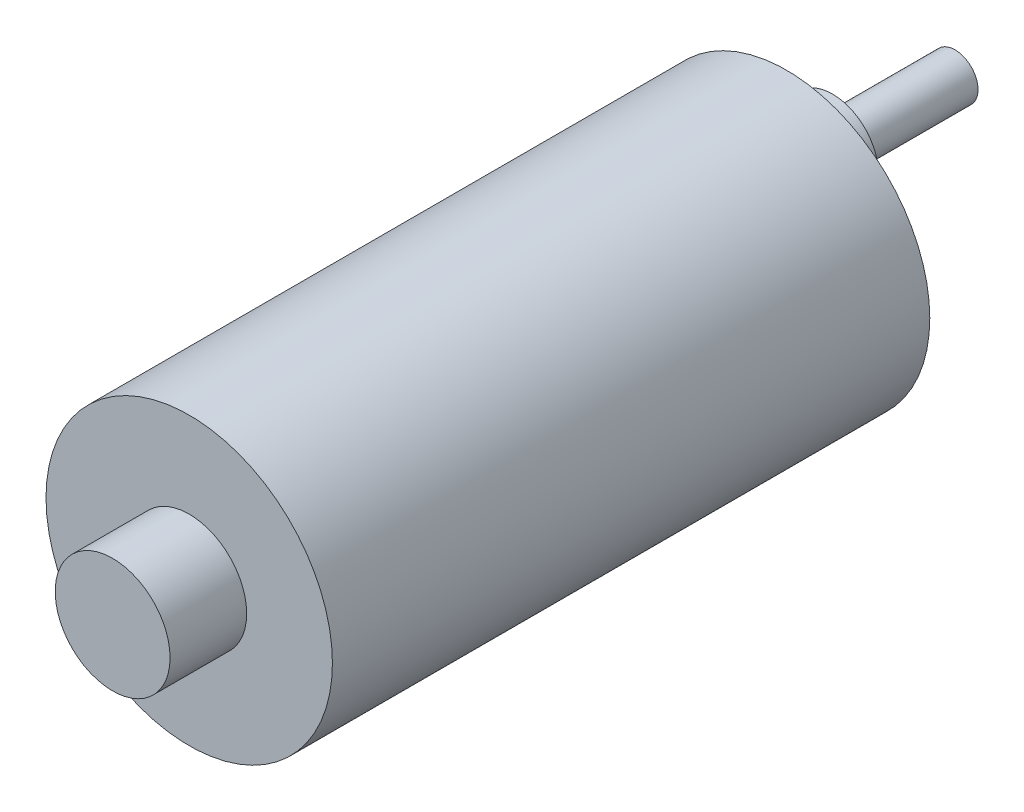
ISO-10303-21;
HEADER;
FILE_DESCRIPTION(('STEP AP214'),'2;1');
FILE_NAME('part.step','',(''),(''),'','','');
FILE_SCHEMA(('AUTOMOTIVE_DESIGN { 1 0 10303 214 1 1 1 1 }'));
ENDSEC;
DATA;
#1=APPLICATION_CONTEXT('core data for automotive mechanical design processes');
#2=APPLICATION_PROTOCOL_DEFINITION('international standard','automotive_design',2000,#1);
#3=PRODUCT_CONTEXT('',#1,'mechanical');
#4=PRODUCT('Part','Part','',(#3));
#5=PRODUCT_RELATED_PRODUCT_CATEGORY('part','',(#4));
#6=PRODUCT_DEFINITION_FORMATION('','',#4);
#7=PRODUCT_DEFINITION_CONTEXT('part definition',#1,'design');
#8=PRODUCT_DEFINITION('design','',#6,#7);
#9=PRODUCT_DEFINITION_SHAPE('','',#8);
#10=(LENGTH_UNIT() NAMED_UNIT(*) SI_UNIT(.MILLI.,.METRE.));
#11=(NAMED_UNIT(*) PLANE_ANGLE_UNIT() SI_UNIT($,.RADIAN.));
#12=(NAMED_UNIT(*) SI_UNIT($,.STERADIAN.) SOLID_ANGLE_UNIT());
#13=UNCERTAINTY_MEASURE_WITH_UNIT(LENGTH_MEASURE(1.E-05),#10,'distance_accuracy_value','');
#14=(GEOMETRIC_REPRESENTATION_CONTEXT(3) GLOBAL_UNCERTAINTY_ASSIGNED_CONTEXT((#13)) GLOBAL_UNIT_ASSIGNED_CONTEXT((#10,
#11,#12)) REPRESENTATION_CONTEXT('',''));
#15=CARTESIAN_POINT('',(0.,0.,0.));
#16=DIRECTION('',(0.,0.,1.));
#17=DIRECTION('',(1.,0.,0.));
#18=AXIS2_PLACEMENT_3D('',#15,#16,#17);
#19=CARTESIAN_POINT('',(0.,0.,78.));
#20=DIRECTION('',(0.,0.,-1.));
#21=DIRECTION('',(-1.,0.,0.));
#22=AXIS2_PLACEMENT_3D('',#19,#20,#21);
#23=CYLINDRICAL_SURFACE('',#22,18.7);
#24=CARTESIAN_POINT('',(0.,0.,78.));
#25=DIRECTION('',(0.,0.,1.));
#26=DIRECTION('',(1.,0.,0.));
#27=AXIS2_PLACEMENT_3D('',#24,#25,#26);
#28=CIRCLE('',#27,18.7);
#29=CARTESIAN_POINT('',(18.7,0.,78.));
#30=VERTEX_POINT('',#29);
#31=EDGE_CURVE('E100',#30,#30,#28,.T.);
#32=ORIENTED_EDGE('',*,*,#31,.F.);
#33=EDGE_LOOP('',(#32));
#34=FACE_BOUND('',#33,.T.);
#35=CARTESIAN_POINT('',(0.,0.,0.));
#36=DIRECTION('',(0.,0.,1.));
#37=DIRECTION('',(1.,0.,0.));
#38=AXIS2_PLACEMENT_3D('',#35,#36,#37);
#39=CIRCLE('',#38,18.7);
#40=CARTESIAN_POINT('',(18.7,0.,0.));
#41=VERTEX_POINT('',#40);
#42=EDGE_CURVE('E95',#41,#41,#39,.T.);
#43=ORIENTED_EDGE('',*,*,#42,.T.);
#44=EDGE_LOOP('',(#43));
#45=FACE_BOUND('',#44,.T.);
#46=ADVANCED_FACE('F45',(#34,#45),#23,.T.);
#47=CARTESIAN_POINT('',(0.,0.,78.));
#48=DIRECTION('',(0.,0.,1.));
#49=DIRECTION('',(1.,0.,0.));
#50=AXIS2_PLACEMENT_3D('',#47,#48,#49);
#51=PLANE('',#50);
#52=CARTESIAN_POINT('',(0.,0.,78.));
#53=DIRECTION('',(0.,0.,1.));
#54=DIRECTION('',(1.,0.,0.));
#55=AXIS2_PLACEMENT_3D('',#52,#53,#54);
#56=CIRCLE('',#55,7.5);
#57=CARTESIAN_POINT('',(7.5,0.,78.));
#58=VERTEX_POINT('',#57);
#59=EDGE_CURVE('E58',#58,#58,#56,.T.);
#60=ORIENTED_EDGE('',*,*,#59,.F.);
#61=EDGE_LOOP('',(#60));
#62=FACE_BOUND('',#61,.T.);
#63=ORIENTED_EDGE('',*,*,#31,.T.);
#64=EDGE_LOOP('',(#63));
#65=FACE_BOUND('',#64,.T.);
#66=ADVANCED_FACE('F135',(#62,#65),#51,.T.);
#67=CARTESIAN_POINT('',(0.,0.,0.));
#68=DIRECTION('',(0.,0.,1.));
#69=DIRECTION('',(1.,0.,0.));
#70=AXIS2_PLACEMENT_3D('',#67,#68,#69);
#71=PLANE('',#70);
#72=CARTESIAN_POINT('',(0.,7.,0.));
#73=DIRECTION('',(0.,0.,1.));
#74=DIRECTION('',(1.,0.,0.));
#75=AXIS2_PLACEMENT_3D('',#72,#73,#74);
#76=CIRCLE('',#75,6.);
#77=CARTESIAN_POINT('',(6.,7.,0.));
#78=VERTEX_POINT('',#77);
#79=EDGE_CURVE('E48',#78,#78,#76,.F.);
#80=ORIENTED_EDGE('',*,*,#79,.F.);
#81=EDGE_LOOP('',(#80));
#82=FACE_BOUND('',#81,.T.);
#83=CARTESIAN_POINT('',(0.,15.5,0.));
#84=DIRECTION('',(0.,0.,1.));
#85=DIRECTION('',(1.,0.,0.));
#86=AXIS2_PLACEMENT_3D('',#83,#84,#85);
#87=CIRCLE('',#86,1.55);
#88=CARTESIAN_POINT('',(1.55,15.5,0.));
#89=VERTEX_POINT('',#88);
#90=EDGE_CURVE('E96',#89,#89,#87,.F.);
#91=ORIENTED_EDGE('',*,*,#90,.F.);
#92=EDGE_LOOP('',(#91));
#93=FACE_BOUND('',#92,.T.);
#94=CARTESIAN_POINT('',(13.4233937586587,7.75000000000016,0.));
#95=DIRECTION('',(0.,0.,1.));
#96=DIRECTION('',(1.,0.,0.));
#97=AXIS2_PLACEMENT_3D('',#94,#95,#96);
#98=CIRCLE('',#97,1.55);
#99=CARTESIAN_POINT('',(14.9733937586587,7.75000000000016,0.));
#100=VERTEX_POINT('',#99);
#101=EDGE_CURVE('E122',#100,#100,#98,.F.);
#102=ORIENTED_EDGE('',*,*,#101,.F.);
#103=EDGE_LOOP('',(#102));
#104=FACE_BOUND('',#103,.T.);
#105=CARTESIAN_POINT('',(13.4233937586589,-7.74999999999987,0.));
#106=DIRECTION('',(0.,0.,1.));
#107=DIRECTION('',(1.,0.,0.));
#108=AXIS2_PLACEMENT_3D('',#105,#106,#107);
#109=CIRCLE('',#108,1.55);
#110=CARTESIAN_POINT('',(14.9733937586589,-7.74999999999987,0.));
#111=VERTEX_POINT('',#110);
#112=EDGE_CURVE('E118',#111,#111,#109,.F.);
#113=ORIENTED_EDGE('',*,*,#112,.F.);
#114=EDGE_LOOP('',(#113));
#115=FACE_BOUND('',#114,.T.);
#116=CARTESIAN_POINT('',(1.08235921504137E-13,-15.5,0.));
#117=DIRECTION('',(0.,0.,1.));
#118=DIRECTION('',(1.,0.,0.));
#119=AXIS2_PLACEMENT_3D('',#116,#117,#118);
#120=CIRCLE('',#119,1.55);
#121=CARTESIAN_POINT('',(1.55000000000011,-15.5,0.));
#122=VERTEX_POINT('',#121);
#123=EDGE_CURVE('E114',#122,#122,#120,.F.);
#124=ORIENTED_EDGE('',*,*,#123,.F.);
#125=EDGE_LOOP('',(#124));
#126=FACE_BOUND('',#125,.T.);
#127=CARTESIAN_POINT('',(-13.4233937586588,-7.75000000000006,0.));
#128=DIRECTION('',(0.,0.,1.));
#129=DIRECTION('',(1.,0.,0.));
#130=AXIS2_PLACEMENT_3D('',#127,#128,#129);
#131=CIRCLE('',#130,1.55);
#132=CARTESIAN_POINT('',(-11.8733937586588,-7.75000000000006,0.));
#133=VERTEX_POINT('',#132);
#134=EDGE_CURVE('E110',#133,#133,#131,.F.);
#135=ORIENTED_EDGE('',*,*,#134,.F.);
#136=EDGE_LOOP('',(#135));
#137=FACE_BOUND('',#136,.T.);
#138=CARTESIAN_POINT('',(-13.4233937586588,7.74999999999997,0.));
#139=DIRECTION('',(0.,0.,1.));
#140=DIRECTION('',(1.,0.,0.));
#141=AXIS2_PLACEMENT_3D('',#138,#139,#140);
#142=CIRCLE('',#141,1.55);
#143=CARTESIAN_POINT('',(-11.8733937586588,7.74999999999997,0.));
#144=VERTEX_POINT('',#143);
#145=EDGE_CURVE('E90',#144,#144,#142,.F.);
#146=ORIENTED_EDGE('',*,*,#145,.F.);
#147=EDGE_LOOP('',(#146));
#148=FACE_BOUND('',#147,.T.);
#149=ORIENTED_EDGE('',*,*,#42,.F.);
#150=EDGE_LOOP('',(#149));
#151=FACE_BOUND('',#150,.T.);
#152=ADVANCED_FACE('F131',(#82,#93,#104,#115,#126,#137,#148,#151),#71,.F.);
#153=CARTESIAN_POINT('',(0.,0.,88.));
#154=DIRECTION('',(0.,0.,-1.));
#155=DIRECTION('',(-1.,0.,0.));
#156=AXIS2_PLACEMENT_3D('',#153,#154,#155);
#157=CYLINDRICAL_SURFACE('',#156,7.5);
#158=CARTESIAN_POINT('',(0.,0.,88.));
#159=DIRECTION('',(0.,0.,1.));
#160=DIRECTION('',(1.,0.,0.));
#161=AXIS2_PLACEMENT_3D('',#158,#159,#160);
#162=CIRCLE('',#161,7.5);
#163=CARTESIAN_POINT('',(7.5,0.,88.));
#164=VERTEX_POINT('',#163);
#165=EDGE_CURVE('E91',#164,#164,#162,.T.);
#166=ORIENTED_EDGE('',*,*,#165,.F.);
#167=EDGE_LOOP('',(#166));
#168=FACE_BOUND('',#167,.T.);
#169=ORIENTED_EDGE('',*,*,#59,.T.);
#170=EDGE_LOOP('',(#169));
#171=FACE_BOUND('',#170,.T.);
#172=ADVANCED_FACE('F134',(#168,#171),#157,.T.);
#173=CARTESIAN_POINT('',(0.,0.,88.));
#174=DIRECTION('',(0.,0.,1.));
#175=DIRECTION('',(1.,0.,0.));
#176=AXIS2_PLACEMENT_3D('',#173,#174,#175);
#177=PLANE('',#176);
#178=ORIENTED_EDGE('',*,*,#165,.T.);
#179=EDGE_LOOP('',(#178));
#180=FACE_BOUND('',#179,.T.);
#181=ADVANCED_FACE('F164',(#180),#177,.T.);
#182=CARTESIAN_POINT('',(-13.4233937586588,7.74999999999997,-1.2E-05));
#183=DIRECTION('',(0.,0.,1.));
#184=DIRECTION('',(1.,0.,0.));
#185=AXIS2_PLACEMENT_3D('',#182,#183,#184);
#186=CYLINDRICAL_SURFACE('',#185,1.55);
#187=CARTESIAN_POINT('',(-13.4233937586588,7.74999999999997,10.));
#188=DIRECTION('',(0.,0.,-1.));
#189=DIRECTION('',(-1.,0.,0.));
#190=AXIS2_PLACEMENT_3D('',#187,#188,#189);
#191=CIRCLE('',#190,1.55);
#192=CARTESIAN_POINT('',(-11.8733937586588,7.74999999999997,10.));
#193=VERTEX_POINT('',#192);
#194=EDGE_CURVE('E71',#193,#193,#191,.T.);
#195=CARTESIAN_POINT('',(-11.8733937586588,7.74999999999997,10.));
#196=CARTESIAN_POINT('',(-11.8733937586588,7.74999999999997,9.89583333333333));
#197=CARTESIAN_POINT('',(-11.8733937586588,7.74999999999997,9.79166666666667));
#198=CARTESIAN_POINT('',(-11.8733937586588,7.74999999999997,9.58333333333333));
#199=CARTESIAN_POINT('',(-11.8733937586588,7.74999999999997,9.47916666666667));
#200=CARTESIAN_POINT('',(-11.8733937586588,7.74999999999997,9.27083333333333));
#201=CARTESIAN_POINT('',(-11.8733937586588,7.74999999999997,9.16666666666667));
#202=CARTESIAN_POINT('',(-11.8733937586588,7.74999999999997,8.95833333333333));
#203=CARTESIAN_POINT('',(-11.8733937586588,7.74999999999997,8.85416666666667));
#204=CARTESIAN_POINT('',(-11.8733937586588,7.74999999999997,8.64583333333333));
#205=CARTESIAN_POINT('',(-11.8733937586588,7.74999999999997,8.54166666666667));
#206=CARTESIAN_POINT('',(-11.8733937586588,7.74999999999997,8.33333333333333));
#207=CARTESIAN_POINT('',(-11.8733937586588,7.74999999999997,8.22916666666667));
#208=CARTESIAN_POINT('',(-11.8733937586588,7.74999999999997,8.02083333333333));
#209=CARTESIAN_POINT('',(-11.8733937586588,7.74999999999997,7.91666666666667));
#210=CARTESIAN_POINT('',(-11.8733937586588,7.74999999999997,7.70833333333333));
#211=CARTESIAN_POINT('',(-11.8733937586588,7.74999999999997,7.60416666666667));
#212=CARTESIAN_POINT('',(-11.8733937586588,7.74999999999997,7.39583333333333));
#213=CARTESIAN_POINT('',(-11.8733937586588,7.74999999999997,7.29166666666667));
#214=CARTESIAN_POINT('',(-11.8733937586588,7.74999999999997,7.08333333333333));
#215=CARTESIAN_POINT('',(-11.8733937586588,7.74999999999997,6.97916666666667));
#216=CARTESIAN_POINT('',(-11.8733937586588,7.74999999999997,6.77083333333333));
#217=CARTESIAN_POINT('',(-11.8733937586588,7.74999999999997,6.66666666666667));
#218=CARTESIAN_POINT('',(-11.8733937586588,7.74999999999997,6.45833333333333));
#219=CARTESIAN_POINT('',(-11.8733937586588,7.74999999999997,6.35416666666667));
#220=CARTESIAN_POINT('',(-11.8733937586588,7.74999999999997,6.14583333333333));
#221=CARTESIAN_POINT('',(-11.8733937586588,7.74999999999997,6.04166666666667));
#222=CARTESIAN_POINT('',(-11.8733937586588,7.74999999999997,5.83333333333333));
#223=CARTESIAN_POINT('',(-11.8733937586588,7.74999999999997,5.72916666666667));
#224=CARTESIAN_POINT('',(-11.8733937586588,7.74999999999997,5.52083333333333));
#225=CARTESIAN_POINT('',(-11.8733937586588,7.74999999999997,5.41666666666667));
#226=CARTESIAN_POINT('',(-11.8733937586588,7.74999999999997,5.20833333333333));
#227=CARTESIAN_POINT('',(-11.8733937586588,7.74999999999997,5.10416666666667));
#228=CARTESIAN_POINT('',(-11.8733937586588,7.74999999999997,4.89583333333333));
#229=CARTESIAN_POINT('',(-11.8733937586588,7.74999999999997,4.79166666666667));
#230=CARTESIAN_POINT('',(-11.8733937586588,7.74999999999997,4.58333333333333));
#231=CARTESIAN_POINT('',(-11.8733937586588,7.74999999999997,4.47916666666667));
#232=CARTESIAN_POINT('',(-11.8733937586588,7.74999999999997,4.27083333333333));
#233=CARTESIAN_POINT('',(-11.8733937586588,7.74999999999997,4.16666666666667));
#234=CARTESIAN_POINT('',(-11.8733937586588,7.74999999999997,3.95833333333333));
#235=CARTESIAN_POINT('',(-11.8733937586588,7.74999999999997,3.85416666666667));
#236=CARTESIAN_POINT('',(-11.8733937586588,7.74999999999997,3.64583333333333));
#237=CARTESIAN_POINT('',(-11.8733937586588,7.74999999999997,3.54166666666667));
#238=CARTESIAN_POINT('',(-11.8733937586588,7.74999999999997,3.33333333333333));
#239=CARTESIAN_POINT('',(-11.8733937586588,7.74999999999997,3.22916666666667));
#240=CARTESIAN_POINT('',(-11.8733937586588,7.74999999999997,3.02083333333333));
#241=CARTESIAN_POINT('',(-11.8733937586588,7.74999999999997,2.91666666666667));
#242=CARTESIAN_POINT('',(-11.8733937586588,7.74999999999997,2.70833333333333));
#243=CARTESIAN_POINT('',(-11.8733937586588,7.74999999999997,2.60416666666667));
#244=CARTESIAN_POINT('',(-11.8733937586588,7.74999999999997,2.39583333333333));
#245=CARTESIAN_POINT('',(-11.8733937586588,7.74999999999997,2.29166666666667));
#246=CARTESIAN_POINT('',(-11.8733937586588,7.74999999999997,2.08333333333333));
#247=CARTESIAN_POINT('',(-11.8733937586588,7.74999999999997,1.97916666666667));
#248=CARTESIAN_POINT('',(-11.8733937586588,7.74999999999997,1.77083333333333));
#249=CARTESIAN_POINT('',(-11.8733937586588,7.74999999999997,1.66666666666667));
#250=CARTESIAN_POINT('',(-11.8733937586588,7.74999999999997,1.45833333333333));
#251=CARTESIAN_POINT('',(-11.8733937586588,7.74999999999997,1.35416666666667));
#252=CARTESIAN_POINT('',(-11.8733937586588,7.74999999999997,1.14583333333333));
#253=CARTESIAN_POINT('',(-11.8733937586588,7.74999999999997,1.04166666666667));
#254=CARTESIAN_POINT('',(-11.8733937586588,7.74999999999997,0.833333333333335));
#255=CARTESIAN_POINT('',(-11.8733937586588,7.74999999999997,0.729166666666668));
#256=CARTESIAN_POINT('',(-11.8733937586588,7.74999999999997,0.520833333333334));
#257=CARTESIAN_POINT('',(-11.8733937586588,7.74999999999997,0.416666666666668));
#258=CARTESIAN_POINT('',(-11.8733937586588,7.74999999999997,0.208333333333334));
#259=CARTESIAN_POINT('',(-11.8733937586588,7.74999999999997,0.104166666666667));
#260=CARTESIAN_POINT('',(-11.8733937586588,7.74999999999997,0.));
#261=B_SPLINE_CURVE_WITH_KNOTS('',3,(#195,#196,#197,#198,#199,#200,#201,#202,#203,#204,#205,
#206,#207,#208,#209,#210,#211,#212,#213,#214,#215,#216,#217,#218,#219,#220,#221,#222,#223,#224,
#225,#226,#227,#228,#229,#230,#231,#232,#233,#234,#235,#236,#237,#238,#239,#240,#241,#242,#243,
#244,#245,#246,#247,#248,#249,#250,#251,#252,#253,#254,#255,#256,#257,#258,#259,#260),
.UNSPECIFIED.,.F.,.F.,(4,2,2,2,2,2,2,2,2,2,2,2,2,2,2,2,2,2,2,2,2,2,2,2,2,2,2,2,2,2,2,2,4),(0.,
0.3125,0.625000000000001,0.937500000000001,1.25,1.5625,1.875,2.1875,2.5,2.8125,3.125,3.4375,
3.75,4.0625,4.375,4.6875,5.,5.3125,5.625,5.9375,6.25,6.5625,6.875,7.1875,7.5,7.8125,8.125,
8.4375,8.75,9.0625,9.375,9.6875,10.),.UNSPECIFIED.);
#262=EDGE_CURVE('BSEAM168',#193,#144,#261,.T.);
#263=ORIENTED_EDGE('',*,*,#194,.F.);
#264=ORIENTED_EDGE('',*,*,#145,.T.);
#265=ORIENTED_EDGE('',*,*,#262,.T.);
#266=ORIENTED_EDGE('',*,*,#262,.F.);
#267=EDGE_LOOP('',(#263,#265,#264,#266));
#268=FACE_BOUND('',#267,.T.);
#269=ADVANCED_FACE('F168',(#268),#186,.F.);
#270=CARTESIAN_POINT('',(-13.4233937586588,7.74999999999997,10.));
#271=DIRECTION('',(0.,0.,-1.));
#272=DIRECTION('',(-1.,0.,0.));
#273=AXIS2_PLACEMENT_3D('',#270,#271,#272);
#274=PLANE('',#273);
#275=ORIENTED_EDGE('',*,*,#194,.T.);
#276=EDGE_LOOP('',(#275));
#277=FACE_BOUND('',#276,.T.);
#278=ADVANCED_FACE('F172',(#277),#274,.T.);
#279=CARTESIAN_POINT('',(-13.4233937586588,-7.75000000000006,-1.2E-05));
#280=DIRECTION('',(0.,0.,1.));
#281=DIRECTION('',(1.,0.,0.));
#282=AXIS2_PLACEMENT_3D('',#279,#280,#281);
#283=CYLINDRICAL_SURFACE('',#282,1.55);
#284=CARTESIAN_POINT('',(-13.4233937586588,-7.75000000000006,10.));
#285=DIRECTION('',(0.,0.,-1.));
#286=DIRECTION('',(-1.,0.,0.));
#287=AXIS2_PLACEMENT_3D('',#284,#285,#286);
#288=CIRCLE('',#287,1.55);
#289=CARTESIAN_POINT('',(-11.8733937586588,-7.75000000000006,10.));
#290=VERTEX_POINT('',#289);
#291=EDGE_CURVE('E67',#290,#290,#288,.T.);
#292=CARTESIAN_POINT('',(-11.8733937586588,-7.75000000000006,10.));
#293=CARTESIAN_POINT('',(-11.8733937586588,-7.75000000000006,9.89583333333333));
#294=CARTESIAN_POINT('',(-11.8733937586588,-7.75000000000006,9.79166666666667));
#295=CARTESIAN_POINT('',(-11.8733937586588,-7.75000000000006,9.58333333333333));
#296=CARTESIAN_POINT('',(-11.8733937586588,-7.75000000000006,9.47916666666667));
#297=CARTESIAN_POINT('',(-11.8733937586588,-7.75000000000006,9.27083333333333));
#298=CARTESIAN_POINT('',(-11.8733937586588,-7.75000000000006,9.16666666666667));
#299=CARTESIAN_POINT('',(-11.8733937586588,-7.75000000000006,8.95833333333333));
#300=CARTESIAN_POINT('',(-11.8733937586588,-7.75000000000006,8.85416666666667));
#301=CARTESIAN_POINT('',(-11.8733937586588,-7.75000000000006,8.64583333333333));
#302=CARTESIAN_POINT('',(-11.8733937586588,-7.75000000000006,8.54166666666667));
#303=CARTESIAN_POINT('',(-11.8733937586588,-7.75000000000006,8.33333333333333));
#304=CARTESIAN_POINT('',(-11.8733937586588,-7.75000000000006,8.22916666666667));
#305=CARTESIAN_POINT('',(-11.8733937586588,-7.75000000000006,8.02083333333333));
#306=CARTESIAN_POINT('',(-11.8733937586588,-7.75000000000006,7.91666666666667));
#307=CARTESIAN_POINT('',(-11.8733937586588,-7.75000000000006,7.70833333333333));
#308=CARTESIAN_POINT('',(-11.8733937586588,-7.75000000000006,7.60416666666667));
#309=CARTESIAN_POINT('',(-11.8733937586588,-7.75000000000006,7.39583333333333));
#310=CARTESIAN_POINT('',(-11.8733937586588,-7.75000000000006,7.29166666666667));
#311=CARTESIAN_POINT('',(-11.8733937586588,-7.75000000000006,7.08333333333333));
#312=CARTESIAN_POINT('',(-11.8733937586588,-7.75000000000006,6.97916666666667));
#313=CARTESIAN_POINT('',(-11.8733937586588,-7.75000000000006,6.77083333333333));
#314=CARTESIAN_POINT('',(-11.8733937586588,-7.75000000000006,6.66666666666667));
#315=CARTESIAN_POINT('',(-11.8733937586588,-7.75000000000006,6.45833333333333));
#316=CARTESIAN_POINT('',(-11.8733937586588,-7.75000000000006,6.35416666666667));
#317=CARTESIAN_POINT('',(-11.8733937586588,-7.75000000000006,6.14583333333333));
#318=CARTESIAN_POINT('',(-11.8733937586588,-7.75000000000006,6.04166666666667));
#319=CARTESIAN_POINT('',(-11.8733937586588,-7.75000000000006,5.83333333333333));
#320=CARTESIAN_POINT('',(-11.8733937586588,-7.75000000000006,5.72916666666667));
#321=CARTESIAN_POINT('',(-11.8733937586588,-7.75000000000006,5.52083333333333));
#322=CARTESIAN_POINT('',(-11.8733937586588,-7.75000000000006,5.41666666666667));
#323=CARTESIAN_POINT('',(-11.8733937586588,-7.75000000000006,5.20833333333333));
#324=CARTESIAN_POINT('',(-11.8733937586588,-7.75000000000006,5.10416666666667));
#325=CARTESIAN_POINT('',(-11.8733937586588,-7.75000000000006,4.89583333333333));
#326=CARTESIAN_POINT('',(-11.8733937586588,-7.75000000000006,4.79166666666667));
#327=CARTESIAN_POINT('',(-11.8733937586588,-7.75000000000006,4.58333333333333));
#328=CARTESIAN_POINT('',(-11.8733937586588,-7.75000000000006,4.47916666666667));
#329=CARTESIAN_POINT('',(-11.8733937586588,-7.75000000000006,4.27083333333333));
#330=CARTESIAN_POINT('',(-11.8733937586588,-7.75000000000006,4.16666666666667));
#331=CARTESIAN_POINT('',(-11.8733937586588,-7.75000000000006,3.95833333333333));
#332=CARTESIAN_POINT('',(-11.8733937586588,-7.75000000000006,3.85416666666667));
#333=CARTESIAN_POINT('',(-11.8733937586588,-7.75000000000006,3.64583333333333));
#334=CARTESIAN_POINT('',(-11.8733937586588,-7.75000000000006,3.54166666666667));
#335=CARTESIAN_POINT('',(-11.8733937586588,-7.75000000000006,3.33333333333333));
#336=CARTESIAN_POINT('',(-11.8733937586588,-7.75000000000006,3.22916666666667));
#337=CARTESIAN_POINT('',(-11.8733937586588,-7.75000000000006,3.02083333333333));
#338=CARTESIAN_POINT('',(-11.8733937586588,-7.75000000000006,2.91666666666667));
#339=CARTESIAN_POINT('',(-11.8733937586588,-7.75000000000006,2.70833333333333));
#340=CARTESIAN_POINT('',(-11.8733937586588,-7.75000000000006,2.60416666666667));
#341=CARTESIAN_POINT('',(-11.8733937586588,-7.75000000000006,2.39583333333333));
#342=CARTESIAN_POINT('',(-11.8733937586588,-7.75000000000006,2.29166666666667));
#343=CARTESIAN_POINT('',(-11.8733937586588,-7.75000000000006,2.08333333333333));
#344=CARTESIAN_POINT('',(-11.8733937586588,-7.75000000000006,1.97916666666667));
#345=CARTESIAN_POINT('',(-11.8733937586588,-7.75000000000006,1.77083333333333));
#346=CARTESIAN_POINT('',(-11.8733937586588,-7.75000000000006,1.66666666666667));
#347=CARTESIAN_POINT('',(-11.8733937586588,-7.75000000000006,1.45833333333333));
#348=CARTESIAN_POINT('',(-11.8733937586588,-7.75000000000006,1.35416666666667));
#349=CARTESIAN_POINT('',(-11.8733937586588,-7.75000000000006,1.14583333333333));
#350=CARTESIAN_POINT('',(-11.8733937586588,-7.75000000000006,1.04166666666667));
#351=CARTESIAN_POINT('',(-11.8733937586588,-7.75000000000006,0.833333333333335));
#352=CARTESIAN_POINT('',(-11.8733937586588,-7.75000000000006,0.729166666666668));
#353=CARTESIAN_POINT('',(-11.8733937586588,-7.75000000000006,0.520833333333334));
#354=CARTESIAN_POINT('',(-11.8733937586588,-7.75000000000006,0.416666666666668));
#355=CARTESIAN_POINT('',(-11.8733937586588,-7.75000000000006,0.208333333333334));
#356=CARTESIAN_POINT('',(-11.8733937586588,-7.75000000000006,0.104166666666667));
#357=CARTESIAN_POINT('',(-11.8733937586588,-7.75000000000006,0.));
#358=B_SPLINE_CURVE_WITH_KNOTS('',3,(#292,#293,#294,#295,#296,#297,#298,#299,#300,#301,#302,
#303,#304,#305,#306,#307,#308,#309,#310,#311,#312,#313,#314,#315,#316,#317,#318,#319,#320,#321,
#322,#323,#324,#325,#326,#327,#328,#329,#330,#331,#332,#333,#334,#335,#336,#337,#338,#339,#340,
#341,#342,#343,#344,#345,#346,#347,#348,#349,#350,#351,#352,#353,#354,#355,#356,#357),
.UNSPECIFIED.,.F.,.F.,(4,2,2,2,2,2,2,2,2,2,2,2,2,2,2,2,2,2,2,2,2,2,2,2,2,2,2,2,2,2,2,2,4),(0.,
0.3125,0.625000000000001,0.937500000000001,1.25,1.5625,1.875,2.1875,2.5,2.8125,3.125,3.4375,
3.75,4.0625,4.375,4.6875,5.,5.3125,5.625,5.9375,6.25,6.5625,6.875,7.1875,7.5,7.8125,8.125,
8.4375,8.75,9.0625,9.375,9.6875,10.),.UNSPECIFIED.);
#359=EDGE_CURVE('BSEAM176',#290,#133,#358,.T.);
#360=ORIENTED_EDGE('',*,*,#291,.F.);
#361=ORIENTED_EDGE('',*,*,#134,.T.);
#362=ORIENTED_EDGE('',*,*,#359,.T.);
#363=ORIENTED_EDGE('',*,*,#359,.F.);
#364=EDGE_LOOP('',(#360,#362,#361,#363));
#365=FACE_BOUND('',#364,.T.);
#366=ADVANCED_FACE('F176',(#365),#283,.F.);
#367=CARTESIAN_POINT('',(-13.4233937586588,-7.75000000000006,10.));
#368=DIRECTION('',(0.,0.,-1.));
#369=DIRECTION('',(-1.,0.,0.));
#370=AXIS2_PLACEMENT_3D('',#367,#368,#369);
#371=PLANE('',#370);
#372=ORIENTED_EDGE('',*,*,#291,.T.);
#373=EDGE_LOOP('',(#372));
#374=FACE_BOUND('',#373,.T.);
#375=ADVANCED_FACE('F209',(#374),#371,.T.);
#376=CARTESIAN_POINT('',(1.08235921504137E-13,-15.5,-1.2E-05));
#377=DIRECTION('',(0.,0.,1.));
#378=DIRECTION('',(1.,0.,0.));
#379=AXIS2_PLACEMENT_3D('',#376,#377,#378);
#380=CYLINDRICAL_SURFACE('',#379,1.55);
#381=CARTESIAN_POINT('',(1.08235921504137E-13,-15.5,10.));
#382=DIRECTION('',(0.,0.,-1.));
#383=DIRECTION('',(-1.,0.,0.));
#384=AXIS2_PLACEMENT_3D('',#381,#382,#383);
#385=CIRCLE('',#384,1.55);
#386=CARTESIAN_POINT('',(1.55000000000011,-15.5,10.));
#387=VERTEX_POINT('',#386);
#388=EDGE_CURVE('E72',#387,#387,#385,.T.);
#389=CARTESIAN_POINT('',(1.55000000000011,-15.5,10.));
#390=CARTESIAN_POINT('',(1.55000000000011,-15.5,9.89583333333333));
#391=CARTESIAN_POINT('',(1.55000000000011,-15.5,9.79166666666667));
#392=CARTESIAN_POINT('',(1.55000000000011,-15.5,9.58333333333333));
#393=CARTESIAN_POINT('',(1.55000000000011,-15.5,9.47916666666667));
#394=CARTESIAN_POINT('',(1.55000000000011,-15.5,9.27083333333333));
#395=CARTESIAN_POINT('',(1.55000000000011,-15.5,9.16666666666667));
#396=CARTESIAN_POINT('',(1.55000000000011,-15.5,8.95833333333333));
#397=CARTESIAN_POINT('',(1.55000000000011,-15.5,8.85416666666667));
#398=CARTESIAN_POINT('',(1.55000000000011,-15.5,8.64583333333333));
#399=CARTESIAN_POINT('',(1.55000000000011,-15.5,8.54166666666667));
#400=CARTESIAN_POINT('',(1.55000000000011,-15.5,8.33333333333333));
#401=CARTESIAN_POINT('',(1.55000000000011,-15.5,8.22916666666667));
#402=CARTESIAN_POINT('',(1.55000000000011,-15.5,8.02083333333333));
#403=CARTESIAN_POINT('',(1.55000000000011,-15.5,7.91666666666667));
#404=CARTESIAN_POINT('',(1.55000000000011,-15.5,7.70833333333333));
#405=CARTESIAN_POINT('',(1.55000000000011,-15.5,7.60416666666667));
#406=CARTESIAN_POINT('',(1.55000000000011,-15.5,7.39583333333333));
#407=CARTESIAN_POINT('',(1.55000000000011,-15.5,7.29166666666667));
#408=CARTESIAN_POINT('',(1.55000000000011,-15.5,7.08333333333333));
#409=CARTESIAN_POINT('',(1.55000000000011,-15.5,6.97916666666667));
#410=CARTESIAN_POINT('',(1.55000000000011,-15.5,6.77083333333333));
#411=CARTESIAN_POINT('',(1.55000000000011,-15.5,6.66666666666667));
#412=CARTESIAN_POINT('',(1.55000000000011,-15.5,6.45833333333333));
#413=CARTESIAN_POINT('',(1.55000000000011,-15.5,6.35416666666667));
#414=CARTESIAN_POINT('',(1.55000000000011,-15.5,6.14583333333333));
#415=CARTESIAN_POINT('',(1.55000000000011,-15.5,6.04166666666667));
#416=CARTESIAN_POINT('',(1.55000000000011,-15.5,5.83333333333333));
#417=CARTESIAN_POINT('',(1.55000000000011,-15.5,5.72916666666667));
#418=CARTESIAN_POINT('',(1.55000000000011,-15.5,5.52083333333333));
#419=CARTESIAN_POINT('',(1.55000000000011,-15.5,5.41666666666667));
#420=CARTESIAN_POINT('',(1.55000000000011,-15.5,5.20833333333333));
#421=CARTESIAN_POINT('',(1.55000000000011,-15.5,5.10416666666667));
#422=CARTESIAN_POINT('',(1.55000000000011,-15.5,4.89583333333333));
#423=CARTESIAN_POINT('',(1.55000000000011,-15.5,4.79166666666667));
#424=CARTESIAN_POINT('',(1.55000000000011,-15.5,4.58333333333333));
#425=CARTESIAN_POINT('',(1.55000000000011,-15.5,4.47916666666667));
#426=CARTESIAN_POINT('',(1.55000000000011,-15.5,4.27083333333333));
#427=CARTESIAN_POINT('',(1.55000000000011,-15.5,4.16666666666667));
#428=CARTESIAN_POINT('',(1.55000000000011,-15.5,3.95833333333333));
#429=CARTESIAN_POINT('',(1.55000000000011,-15.5,3.85416666666667));
#430=CARTESIAN_POINT('',(1.55000000000011,-15.5,3.64583333333333));
#431=CARTESIAN_POINT('',(1.55000000000011,-15.5,3.54166666666667));
#432=CARTESIAN_POINT('',(1.55000000000011,-15.5,3.33333333333333));
#433=CARTESIAN_POINT('',(1.55000000000011,-15.5,3.22916666666667));
#434=CARTESIAN_POINT('',(1.55000000000011,-15.5,3.02083333333333));
#435=CARTESIAN_POINT('',(1.55000000000011,-15.5,2.91666666666667));
#436=CARTESIAN_POINT('',(1.55000000000011,-15.5,2.70833333333333));
#437=CARTESIAN_POINT('',(1.55000000000011,-15.5,2.60416666666667));
#438=CARTESIAN_POINT('',(1.55000000000011,-15.5,2.39583333333333));
#439=CARTESIAN_POINT('',(1.55000000000011,-15.5,2.29166666666667));
#440=CARTESIAN_POINT('',(1.55000000000011,-15.5,2.08333333333333));
#441=CARTESIAN_POINT('',(1.55000000000011,-15.5,1.97916666666667));
#442=CARTESIAN_POINT('',(1.55000000000011,-15.5,1.77083333333333));
#443=CARTESIAN_POINT('',(1.55000000000011,-15.5,1.66666666666667));
#444=CARTESIAN_POINT('',(1.55000000000011,-15.5,1.45833333333333));
#445=CARTESIAN_POINT('',(1.55000000000011,-15.5,1.35416666666667));
#446=CARTESIAN_POINT('',(1.55000000000011,-15.5,1.14583333333333));
#447=CARTESIAN_POINT('',(1.55000000000011,-15.5,1.04166666666667));
#448=CARTESIAN_POINT('',(1.55000000000011,-15.5,0.833333333333335));
#449=CARTESIAN_POINT('',(1.55000000000011,-15.5,0.729166666666668));
#450=CARTESIAN_POINT('',(1.55000000000011,-15.5,0.520833333333334));
#451=CARTESIAN_POINT('',(1.55000000000011,-15.5,0.416666666666668));
#452=CARTESIAN_POINT('',(1.55000000000011,-15.5,0.208333333333334));
#453=CARTESIAN_POINT('',(1.55000000000011,-15.5,0.104166666666667));
#454=CARTESIAN_POINT('',(1.55000000000011,-15.5,0.));
#455=B_SPLINE_CURVE_WITH_KNOTS('',3,(#389,#390,#391,#392,#393,#394,#395,#396,#397,#398,#399,
#400,#401,#402,#403,#404,#405,#406,#407,#408,#409,#410,#411,#412,#413,#414,#415,#416,#417,#418,
#419,#420,#421,#422,#423,#424,#425,#426,#427,#428,#429,#430,#431,#432,#433,#434,#435,#436,#437,
#438,#439,#440,#441,#442,#443,#444,#445,#446,#447,#448,#449,#450,#451,#452,#453,#454),
.UNSPECIFIED.,.F.,.F.,(4,2,2,2,2,2,2,2,2,2,2,2,2,2,2,2,2,2,2,2,2,2,2,2,2,2,2,2,2,2,2,2,4),(0.,
0.3125,0.625000000000001,0.937500000000001,1.25,1.5625,1.875,2.1875,2.5,2.8125,3.125,3.4375,
3.75,4.0625,4.375,4.6875,5.,5.3125,5.625,5.9375,6.25,6.5625,6.875,7.1875,7.5,7.8125,8.125,
8.4375,8.75,9.0625,9.375,9.6875,10.),.UNSPECIFIED.);
#456=EDGE_CURVE('BSEAM205',#387,#122,#455,.T.);
#457=ORIENTED_EDGE('',*,*,#388,.F.);
#458=ORIENTED_EDGE('',*,*,#123,.T.);
#459=ORIENTED_EDGE('',*,*,#456,.T.);
#460=ORIENTED_EDGE('',*,*,#456,.F.);
#461=EDGE_LOOP('',(#457,#459,#458,#460));
#462=FACE_BOUND('',#461,.T.);
#463=ADVANCED_FACE('F205',(#462),#380,.F.);
#464=CARTESIAN_POINT('',(1.08235921504137E-13,-15.5,10.));
#465=DIRECTION('',(0.,0.,-1.));
#466=DIRECTION('',(-1.,0.,0.));
#467=AXIS2_PLACEMENT_3D('',#464,#465,#466);
#468=PLANE('',#467);
#469=ORIENTED_EDGE('',*,*,#388,.T.);
#470=EDGE_LOOP('',(#469));
#471=FACE_BOUND('',#470,.T.);
#472=ADVANCED_FACE('F201',(#471),#468,.T.);
#473=CARTESIAN_POINT('',(13.4233937586589,-7.74999999999987,-1.2E-05));
#474=DIRECTION('',(0.,0.,1.));
#475=DIRECTION('',(1.,0.,0.));
#476=AXIS2_PLACEMENT_3D('',#473,#474,#475);
#477=CYLINDRICAL_SURFACE('',#476,1.55);
#478=CARTESIAN_POINT('',(13.4233937586589,-7.74999999999987,10.));
#479=DIRECTION('',(0.,0.,-1.));
#480=DIRECTION('',(-1.,0.,0.));
#481=AXIS2_PLACEMENT_3D('',#478,#479,#480);
#482=CIRCLE('',#481,1.55);
#483=CARTESIAN_POINT('',(14.9733937586589,-7.74999999999987,10.));
#484=VERTEX_POINT('',#483);
#485=EDGE_CURVE('E76',#484,#484,#482,.T.);
#486=CARTESIAN_POINT('',(14.9733937586589,-7.74999999999987,10.));
#487=CARTESIAN_POINT('',(14.9733937586589,-7.74999999999987,9.89583333333333));
#488=CARTESIAN_POINT('',(14.9733937586589,-7.74999999999987,9.79166666666667));
#489=CARTESIAN_POINT('',(14.9733937586589,-7.74999999999987,9.58333333333333));
#490=CARTESIAN_POINT('',(14.9733937586589,-7.74999999999987,9.47916666666667));
#491=CARTESIAN_POINT('',(14.9733937586589,-7.74999999999987,9.27083333333333));
#492=CARTESIAN_POINT('',(14.9733937586589,-7.74999999999987,9.16666666666667));
#493=CARTESIAN_POINT('',(14.9733937586589,-7.74999999999987,8.95833333333333));
#494=CARTESIAN_POINT('',(14.9733937586589,-7.74999999999987,8.85416666666667));
#495=CARTESIAN_POINT('',(14.9733937586589,-7.74999999999987,8.64583333333333));
#496=CARTESIAN_POINT('',(14.9733937586589,-7.74999999999987,8.54166666666667));
#497=CARTESIAN_POINT('',(14.9733937586589,-7.74999999999987,8.33333333333333));
#498=CARTESIAN_POINT('',(14.9733937586589,-7.74999999999987,8.22916666666667));
#499=CARTESIAN_POINT('',(14.9733937586589,-7.74999999999987,8.02083333333333));
#500=CARTESIAN_POINT('',(14.9733937586589,-7.74999999999987,7.91666666666667));
#501=CARTESIAN_POINT('',(14.9733937586589,-7.74999999999987,7.70833333333333));
#502=CARTESIAN_POINT('',(14.9733937586589,-7.74999999999987,7.60416666666667));
#503=CARTESIAN_POINT('',(14.9733937586589,-7.74999999999987,7.39583333333333));
#504=CARTESIAN_POINT('',(14.9733937586589,-7.74999999999987,7.29166666666667));
#505=CARTESIAN_POINT('',(14.9733937586589,-7.74999999999987,7.08333333333333));
#506=CARTESIAN_POINT('',(14.9733937586589,-7.74999999999987,6.97916666666667));
#507=CARTESIAN_POINT('',(14.9733937586589,-7.74999999999987,6.77083333333333));
#508=CARTESIAN_POINT('',(14.9733937586589,-7.74999999999987,6.66666666666667));
#509=CARTESIAN_POINT('',(14.9733937586589,-7.74999999999987,6.45833333333333));
#510=CARTESIAN_POINT('',(14.9733937586589,-7.74999999999987,6.35416666666667));
#511=CARTESIAN_POINT('',(14.9733937586589,-7.74999999999987,6.14583333333333));
#512=CARTESIAN_POINT('',(14.9733937586589,-7.74999999999987,6.04166666666667));
#513=CARTESIAN_POINT('',(14.9733937586589,-7.74999999999987,5.83333333333333));
#514=CARTESIAN_POINT('',(14.9733937586589,-7.74999999999987,5.72916666666667));
#515=CARTESIAN_POINT('',(14.9733937586589,-7.74999999999987,5.52083333333333));
#516=CARTESIAN_POINT('',(14.9733937586589,-7.74999999999987,5.41666666666667));
#517=CARTESIAN_POINT('',(14.9733937586589,-7.74999999999987,5.20833333333333));
#518=CARTESIAN_POINT('',(14.9733937586589,-7.74999999999987,5.10416666666667));
#519=CARTESIAN_POINT('',(14.9733937586589,-7.74999999999987,4.89583333333333));
#520=CARTESIAN_POINT('',(14.9733937586589,-7.74999999999987,4.79166666666667));
#521=CARTESIAN_POINT('',(14.9733937586589,-7.74999999999987,4.58333333333333));
#522=CARTESIAN_POINT('',(14.9733937586589,-7.74999999999987,4.47916666666667));
#523=CARTESIAN_POINT('',(14.9733937586589,-7.74999999999987,4.27083333333333));
#524=CARTESIAN_POINT('',(14.9733937586589,-7.74999999999987,4.16666666666667));
#525=CARTESIAN_POINT('',(14.9733937586589,-7.74999999999987,3.95833333333333));
#526=CARTESIAN_POINT('',(14.9733937586589,-7.74999999999987,3.85416666666667));
#527=CARTESIAN_POINT('',(14.9733937586589,-7.74999999999987,3.64583333333333));
#528=CARTESIAN_POINT('',(14.9733937586589,-7.74999999999987,3.54166666666667));
#529=CARTESIAN_POINT('',(14.9733937586589,-7.74999999999987,3.33333333333333));
#530=CARTESIAN_POINT('',(14.9733937586589,-7.74999999999987,3.22916666666667));
#531=CARTESIAN_POINT('',(14.9733937586589,-7.74999999999987,3.02083333333333));
#532=CARTESIAN_POINT('',(14.9733937586589,-7.74999999999987,2.91666666666667));
#533=CARTESIAN_POINT('',(14.9733937586589,-7.74999999999987,2.70833333333333));
#534=CARTESIAN_POINT('',(14.9733937586589,-7.74999999999987,2.60416666666667));
#535=CARTESIAN_POINT('',(14.9733937586589,-7.74999999999987,2.39583333333333));
#536=CARTESIAN_POINT('',(14.9733937586589,-7.74999999999987,2.29166666666667));
#537=CARTESIAN_POINT('',(14.9733937586589,-7.74999999999987,2.08333333333333));
#538=CARTESIAN_POINT('',(14.9733937586589,-7.74999999999987,1.97916666666667));
#539=CARTESIAN_POINT('',(14.9733937586589,-7.74999999999987,1.77083333333333));
#540=CARTESIAN_POINT('',(14.9733937586589,-7.74999999999987,1.66666666666667));
#541=CARTESIAN_POINT('',(14.9733937586589,-7.74999999999987,1.45833333333333));
#542=CARTESIAN_POINT('',(14.9733937586589,-7.74999999999987,1.35416666666667));
#543=CARTESIAN_POINT('',(14.9733937586589,-7.74999999999987,1.14583333333333));
#544=CARTESIAN_POINT('',(14.9733937586589,-7.74999999999987,1.04166666666667));
#545=CARTESIAN_POINT('',(14.9733937586589,-7.74999999999987,0.833333333333335));
#546=CARTESIAN_POINT('',(14.9733937586589,-7.74999999999987,0.729166666666668));
#547=CARTESIAN_POINT('',(14.9733937586589,-7.74999999999987,0.520833333333334));
#548=CARTESIAN_POINT('',(14.9733937586589,-7.74999999999987,0.416666666666668));
#549=CARTESIAN_POINT('',(14.9733937586589,-7.74999999999987,0.208333333333334));
#550=CARTESIAN_POINT('',(14.9733937586589,-7.74999999999987,0.104166666666667));
#551=CARTESIAN_POINT('',(14.9733937586589,-7.74999999999987,0.));
#552=B_SPLINE_CURVE_WITH_KNOTS('',3,(#486,#487,#488,#489,#490,#491,#492,#493,#494,#495,#496,
#497,#498,#499,#500,#501,#502,#503,#504,#505,#506,#507,#508,#509,#510,#511,#512,#513,#514,#515,
#516,#517,#518,#519,#520,#521,#522,#523,#524,#525,#526,#527,#528,#529,#530,#531,#532,#533,#534,
#535,#536,#537,#538,#539,#540,#541,#542,#543,#544,#545,#546,#547,#548,#549,#550,#551),
.UNSPECIFIED.,.F.,.F.,(4,2,2,2,2,2,2,2,2,2,2,2,2,2,2,2,2,2,2,2,2,2,2,2,2,2,2,2,2,2,2,2,4),(0.,
0.3125,0.625000000000001,0.937500000000001,1.25,1.5625,1.875,2.1875,2.5,2.8125,3.125,3.4375,
3.75,4.0625,4.375,4.6875,5.,5.3125,5.625,5.9375,6.25,6.5625,6.875,7.1875,7.5,7.8125,8.125,
8.4375,8.75,9.0625,9.375,9.6875,10.),.UNSPECIFIED.);
#553=EDGE_CURVE('BSEAM197',#484,#111,#552,.T.);
#554=ORIENTED_EDGE('',*,*,#485,.F.);
#555=ORIENTED_EDGE('',*,*,#112,.T.);
#556=ORIENTED_EDGE('',*,*,#553,.T.);
#557=ORIENTED_EDGE('',*,*,#553,.F.);
#558=EDGE_LOOP('',(#554,#556,#555,#557));
#559=FACE_BOUND('',#558,.T.);
#560=ADVANCED_FACE('F197',(#559),#477,.F.);
#561=CARTESIAN_POINT('',(13.4233937586589,-7.74999999999987,10.));
#562=DIRECTION('',(0.,0.,-1.));
#563=DIRECTION('',(-1.,0.,0.));
#564=AXIS2_PLACEMENT_3D('',#561,#562,#563);
#565=PLANE('',#564);
#566=ORIENTED_EDGE('',*,*,#485,.T.);
#567=EDGE_LOOP('',(#566));
#568=FACE_BOUND('',#567,.T.);
#569=ADVANCED_FACE('F193',(#568),#565,.T.);
#570=CARTESIAN_POINT('',(13.4233937586587,7.75000000000016,-1.2E-05));
#571=DIRECTION('',(0.,0.,1.));
#572=DIRECTION('',(1.,0.,0.));
#573=AXIS2_PLACEMENT_3D('',#570,#571,#572);
#574=CYLINDRICAL_SURFACE('',#573,1.55);
#575=CARTESIAN_POINT('',(13.4233937586587,7.75000000000016,10.));
#576=DIRECTION('',(0.,0.,-1.));
#577=DIRECTION('',(-1.,0.,0.));
#578=AXIS2_PLACEMENT_3D('',#575,#576,#577);
#579=CIRCLE('',#578,1.55);
#580=CARTESIAN_POINT('',(14.9733937586587,7.75000000000016,10.));
#581=VERTEX_POINT('',#580);
#582=EDGE_CURVE('E80',#581,#581,#579,.T.);
#583=CARTESIAN_POINT('',(14.9733937586587,7.75000000000016,10.));
#584=CARTESIAN_POINT('',(14.9733937586587,7.75000000000016,9.89583333333333));
#585=CARTESIAN_POINT('',(14.9733937586587,7.75000000000016,9.79166666666667));
#586=CARTESIAN_POINT('',(14.9733937586587,7.75000000000016,9.58333333333333));
#587=CARTESIAN_POINT('',(14.9733937586587,7.75000000000016,9.47916666666667));
#588=CARTESIAN_POINT('',(14.9733937586587,7.75000000000016,9.27083333333333));
#589=CARTESIAN_POINT('',(14.9733937586587,7.75000000000016,9.16666666666667));
#590=CARTESIAN_POINT('',(14.9733937586587,7.75000000000016,8.95833333333333));
#591=CARTESIAN_POINT('',(14.9733937586587,7.75000000000016,8.85416666666667));
#592=CARTESIAN_POINT('',(14.9733937586587,7.75000000000016,8.64583333333333));
#593=CARTESIAN_POINT('',(14.9733937586587,7.75000000000016,8.54166666666667));
#594=CARTESIAN_POINT('',(14.9733937586587,7.75000000000016,8.33333333333333));
#595=CARTESIAN_POINT('',(14.9733937586587,7.75000000000016,8.22916666666667));
#596=CARTESIAN_POINT('',(14.9733937586587,7.75000000000016,8.02083333333333));
#597=CARTESIAN_POINT('',(14.9733937586587,7.75000000000016,7.91666666666667));
#598=CARTESIAN_POINT('',(14.9733937586587,7.75000000000016,7.70833333333333));
#599=CARTESIAN_POINT('',(14.9733937586587,7.75000000000016,7.60416666666667));
#600=CARTESIAN_POINT('',(14.9733937586587,7.75000000000016,7.39583333333333));
#601=CARTESIAN_POINT('',(14.9733937586587,7.75000000000016,7.29166666666667));
#602=CARTESIAN_POINT('',(14.9733937586587,7.75000000000016,7.08333333333333));
#603=CARTESIAN_POINT('',(14.9733937586587,7.75000000000016,6.97916666666667));
#604=CARTESIAN_POINT('',(14.9733937586587,7.75000000000016,6.77083333333333));
#605=CARTESIAN_POINT('',(14.9733937586587,7.75000000000016,6.66666666666667));
#606=CARTESIAN_POINT('',(14.9733937586587,7.75000000000016,6.45833333333333));
#607=CARTESIAN_POINT('',(14.9733937586587,7.75000000000016,6.35416666666667));
#608=CARTESIAN_POINT('',(14.9733937586587,7.75000000000016,6.14583333333333));
#609=CARTESIAN_POINT('',(14.9733937586587,7.75000000000016,6.04166666666667));
#610=CARTESIAN_POINT('',(14.9733937586587,7.75000000000016,5.83333333333333));
#611=CARTESIAN_POINT('',(14.9733937586587,7.75000000000016,5.72916666666667));
#612=CARTESIAN_POINT('',(14.9733937586587,7.75000000000016,5.52083333333333));
#613=CARTESIAN_POINT('',(14.9733937586587,7.75000000000016,5.41666666666667));
#614=CARTESIAN_POINT('',(14.9733937586587,7.75000000000016,5.20833333333333));
#615=CARTESIAN_POINT('',(14.9733937586587,7.75000000000016,5.10416666666667));
#616=CARTESIAN_POINT('',(14.9733937586587,7.75000000000016,4.89583333333333));
#617=CARTESIAN_POINT('',(14.9733937586587,7.75000000000016,4.79166666666667));
#618=CARTESIAN_POINT('',(14.9733937586587,7.75000000000016,4.58333333333333));
#619=CARTESIAN_POINT('',(14.9733937586587,7.75000000000016,4.47916666666667));
#620=CARTESIAN_POINT('',(14.9733937586587,7.75000000000016,4.27083333333333));
#621=CARTESIAN_POINT('',(14.9733937586587,7.75000000000016,4.16666666666667));
#622=CARTESIAN_POINT('',(14.9733937586587,7.75000000000016,3.95833333333333));
#623=CARTESIAN_POINT('',(14.9733937586587,7.75000000000016,3.85416666666667));
#624=CARTESIAN_POINT('',(14.9733937586587,7.75000000000016,3.64583333333333));
#625=CARTESIAN_POINT('',(14.9733937586587,7.75000000000016,3.54166666666667));
#626=CARTESIAN_POINT('',(14.9733937586587,7.75000000000016,3.33333333333333));
#627=CARTESIAN_POINT('',(14.9733937586587,7.75000000000016,3.22916666666667));
#628=CARTESIAN_POINT('',(14.9733937586587,7.75000000000016,3.02083333333333));
#629=CARTESIAN_POINT('',(14.9733937586587,7.75000000000016,2.91666666666667));
#630=CARTESIAN_POINT('',(14.9733937586587,7.75000000000016,2.70833333333333));
#631=CARTESIAN_POINT('',(14.9733937586587,7.75000000000016,2.60416666666667));
#632=CARTESIAN_POINT('',(14.9733937586587,7.75000000000016,2.39583333333333));
#633=CARTESIAN_POINT('',(14.9733937586587,7.75000000000016,2.29166666666667));
#634=CARTESIAN_POINT('',(14.9733937586587,7.75000000000016,2.08333333333333));
#635=CARTESIAN_POINT('',(14.9733937586587,7.75000000000016,1.97916666666667));
#636=CARTESIAN_POINT('',(14.9733937586587,7.75000000000016,1.77083333333333));
#637=CARTESIAN_POINT('',(14.9733937586587,7.75000000000016,1.66666666666667));
#638=CARTESIAN_POINT('',(14.9733937586587,7.75000000000016,1.45833333333333));
#639=CARTESIAN_POINT('',(14.9733937586587,7.75000000000016,1.35416666666667));
#640=CARTESIAN_POINT('',(14.9733937586587,7.75000000000016,1.14583333333333));
#641=CARTESIAN_POINT('',(14.9733937586587,7.75000000000016,1.04166666666667));
#642=CARTESIAN_POINT('',(14.9733937586587,7.75000000000016,0.833333333333335));
#643=CARTESIAN_POINT('',(14.9733937586587,7.75000000000016,0.729166666666668));
#644=CARTESIAN_POINT('',(14.9733937586587,7.75000000000016,0.520833333333334));
#645=CARTESIAN_POINT('',(14.9733937586587,7.75000000000016,0.416666666666668));
#646=CARTESIAN_POINT('',(14.9733937586587,7.75000000000016,0.208333333333334));
#647=CARTESIAN_POINT('',(14.9733937586587,7.75000000000016,0.104166666666667));
#648=CARTESIAN_POINT('',(14.9733937586587,7.75000000000016,0.));
#649=B_SPLINE_CURVE_WITH_KNOTS('',3,(#583,#584,#585,#586,#587,#588,#589,#590,#591,#592,#593,
#594,#595,#596,#597,#598,#599,#600,#601,#602,#603,#604,#605,#606,#607,#608,#609,#610,#611,#612,
#613,#614,#615,#616,#617,#618,#619,#620,#621,#622,#623,#624,#625,#626,#627,#628,#629,#630,#631,
#632,#633,#634,#635,#636,#637,#638,#639,#640,#641,#642,#643,#644,#645,#646,#647,#648),
.UNSPECIFIED.,.F.,.F.,(4,2,2,2,2,2,2,2,2,2,2,2,2,2,2,2,2,2,2,2,2,2,2,2,2,2,2,2,2,2,2,2,4),(0.,
0.3125,0.625000000000001,0.937500000000001,1.25,1.5625,1.875,2.1875,2.5,2.8125,3.125,3.4375,
3.75,4.0625,4.375,4.6875,5.,5.3125,5.625,5.9375,6.25,6.5625,6.875,7.1875,7.5,7.8125,8.125,
8.4375,8.75,9.0625,9.375,9.6875,10.),.UNSPECIFIED.);
#650=EDGE_CURVE('BSEAM189',#581,#100,#649,.T.);
#651=ORIENTED_EDGE('',*,*,#582,.F.);
#652=ORIENTED_EDGE('',*,*,#101,.T.);
#653=ORIENTED_EDGE('',*,*,#650,.T.);
#654=ORIENTED_EDGE('',*,*,#650,.F.);
#655=EDGE_LOOP('',(#651,#653,#652,#654));
#656=FACE_BOUND('',#655,.T.);
#657=ADVANCED_FACE('F189',(#656),#574,.F.);
#658=CARTESIAN_POINT('',(13.4233937586587,7.75000000000016,10.));
#659=DIRECTION('',(0.,0.,-1.));
#660=DIRECTION('',(-1.,0.,0.));
#661=AXIS2_PLACEMENT_3D('',#658,#659,#660);
#662=PLANE('',#661);
#663=ORIENTED_EDGE('',*,*,#582,.T.);
#664=EDGE_LOOP('',(#663));
#665=FACE_BOUND('',#664,.T.);
#666=ADVANCED_FACE('F185',(#665),#662,.T.);
#667=CARTESIAN_POINT('',(0.,15.5,-1.2E-05));
#668=DIRECTION('',(0.,0.,1.));
#669=DIRECTION('',(1.,0.,0.));
#670=AXIS2_PLACEMENT_3D('',#667,#668,#669);
#671=CYLINDRICAL_SURFACE('',#670,1.55);
#672=CARTESIAN_POINT('',(0.,15.5,10.));
#673=DIRECTION('',(0.,0.,-1.));
#674=DIRECTION('',(-1.,0.,0.));
#675=AXIS2_PLACEMENT_3D('',#672,#673,#674);
#676=CIRCLE('',#675,1.55);
#677=CARTESIAN_POINT('',(1.55,15.5,10.));
#678=VERTEX_POINT('',#677);
#679=EDGE_CURVE('E66',#678,#678,#676,.T.);
#680=CARTESIAN_POINT('',(1.55,15.5,10.));
#681=CARTESIAN_POINT('',(1.55,15.5,9.89583333333333));
#682=CARTESIAN_POINT('',(1.55,15.5,9.79166666666667));
#683=CARTESIAN_POINT('',(1.55,15.5,9.58333333333333));
#684=CARTESIAN_POINT('',(1.55,15.5,9.47916666666667));
#685=CARTESIAN_POINT('',(1.55,15.5,9.27083333333333));
#686=CARTESIAN_POINT('',(1.55,15.5,9.16666666666667));
#687=CARTESIAN_POINT('',(1.55,15.5,8.95833333333333));
#688=CARTESIAN_POINT('',(1.55,15.5,8.85416666666667));
#689=CARTESIAN_POINT('',(1.55,15.5,8.64583333333333));
#690=CARTESIAN_POINT('',(1.55,15.5,8.54166666666667));
#691=CARTESIAN_POINT('',(1.55,15.5,8.33333333333333));
#692=CARTESIAN_POINT('',(1.55,15.5,8.22916666666667));
#693=CARTESIAN_POINT('',(1.55,15.5,8.02083333333333));
#694=CARTESIAN_POINT('',(1.55,15.5,7.91666666666667));
#695=CARTESIAN_POINT('',(1.55,15.5,7.70833333333333));
#696=CARTESIAN_POINT('',(1.55,15.5,7.60416666666667));
#697=CARTESIAN_POINT('',(1.55,15.5,7.39583333333333));
#698=CARTESIAN_POINT('',(1.55,15.5,7.29166666666667));
#699=CARTESIAN_POINT('',(1.55,15.5,7.08333333333333));
#700=CARTESIAN_POINT('',(1.55,15.5,6.97916666666667));
#701=CARTESIAN_POINT('',(1.55,15.5,6.77083333333333));
#702=CARTESIAN_POINT('',(1.55,15.5,6.66666666666667));
#703=CARTESIAN_POINT('',(1.55,15.5,6.45833333333333));
#704=CARTESIAN_POINT('',(1.55,15.5,6.35416666666667));
#705=CARTESIAN_POINT('',(1.55,15.5,6.14583333333333));
#706=CARTESIAN_POINT('',(1.55,15.5,6.04166666666667));
#707=CARTESIAN_POINT('',(1.55,15.5,5.83333333333333));
#708=CARTESIAN_POINT('',(1.55,15.5,5.72916666666667));
#709=CARTESIAN_POINT('',(1.55,15.5,5.52083333333333));
#710=CARTESIAN_POINT('',(1.55,15.5,5.41666666666667));
#711=CARTESIAN_POINT('',(1.55,15.5,5.20833333333333));
#712=CARTESIAN_POINT('',(1.55,15.5,5.10416666666667));
#713=CARTESIAN_POINT('',(1.55,15.5,4.89583333333333));
#714=CARTESIAN_POINT('',(1.55,15.5,4.79166666666667));
#715=CARTESIAN_POINT('',(1.55,15.5,4.58333333333333));
#716=CARTESIAN_POINT('',(1.55,15.5,4.47916666666667));
#717=CARTESIAN_POINT('',(1.55,15.5,4.27083333333333));
#718=CARTESIAN_POINT('',(1.55,15.5,4.16666666666667));
#719=CARTESIAN_POINT('',(1.55,15.5,3.95833333333333));
#720=CARTESIAN_POINT('',(1.55,15.5,3.85416666666667));
#721=CARTESIAN_POINT('',(1.55,15.5,3.64583333333333));
#722=CARTESIAN_POINT('',(1.55,15.5,3.54166666666667));
#723=CARTESIAN_POINT('',(1.55,15.5,3.33333333333333));
#724=CARTESIAN_POINT('',(1.55,15.5,3.22916666666667));
#725=CARTESIAN_POINT('',(1.55,15.5,3.02083333333333));
#726=CARTESIAN_POINT('',(1.55,15.5,2.91666666666667));
#727=CARTESIAN_POINT('',(1.55,15.5,2.70833333333333));
#728=CARTESIAN_POINT('',(1.55,15.5,2.60416666666667));
#729=CARTESIAN_POINT('',(1.55,15.5,2.39583333333333));
#730=CARTESIAN_POINT('',(1.55,15.5,2.29166666666667));
#731=CARTESIAN_POINT('',(1.55,15.5,2.08333333333333));
#732=CARTESIAN_POINT('',(1.55,15.5,1.97916666666667));
#733=CARTESIAN_POINT('',(1.55,15.5,1.77083333333333));
#734=CARTESIAN_POINT('',(1.55,15.5,1.66666666666667));
#735=CARTESIAN_POINT('',(1.55,15.5,1.45833333333333));
#736=CARTESIAN_POINT('',(1.55,15.5,1.35416666666667));
#737=CARTESIAN_POINT('',(1.55,15.5,1.14583333333333));
#738=CARTESIAN_POINT('',(1.55,15.5,1.04166666666667));
#739=CARTESIAN_POINT('',(1.55,15.5,0.833333333333335));
#740=CARTESIAN_POINT('',(1.55,15.5,0.729166666666668));
#741=CARTESIAN_POINT('',(1.55,15.5,0.520833333333334));
#742=CARTESIAN_POINT('',(1.55,15.5,0.416666666666668));
#743=CARTESIAN_POINT('',(1.55,15.5,0.208333333333334));
#744=CARTESIAN_POINT('',(1.55,15.5,0.104166666666667));
#745=CARTESIAN_POINT('',(1.55,15.5,0.));
#746=B_SPLINE_CURVE_WITH_KNOTS('',3,(#680,#681,#682,#683,#684,#685,#686,#687,#688,#689,#690,
#691,#692,#693,#694,#695,#696,#697,#698,#699,#700,#701,#702,#703,#704,#705,#706,#707,#708,#709,
#710,#711,#712,#713,#714,#715,#716,#717,#718,#719,#720,#721,#722,#723,#724,#725,#726,#727,#728,
#729,#730,#731,#732,#733,#734,#735,#736,#737,#738,#739,#740,#741,#742,#743,#744,#745),
.UNSPECIFIED.,.F.,.F.,(4,2,2,2,2,2,2,2,2,2,2,2,2,2,2,2,2,2,2,2,2,2,2,2,2,2,2,2,2,2,2,2,4),(0.,
0.3125,0.625000000000001,0.937500000000001,1.25,1.5625,1.875,2.1875,2.5,2.8125,3.125,3.4375,
3.75,4.0625,4.375,4.6875,5.,5.3125,5.625,5.9375,6.25,6.5625,6.875,7.1875,7.5,7.8125,8.125,
8.4375,8.75,9.0625,9.375,9.6875,10.),.UNSPECIFIED.);
#747=EDGE_CURVE('BSEAM129',#678,#89,#746,.T.);
#748=ORIENTED_EDGE('',*,*,#679,.F.);
#749=ORIENTED_EDGE('',*,*,#90,.T.);
#750=ORIENTED_EDGE('',*,*,#747,.T.);
#751=ORIENTED_EDGE('',*,*,#747,.F.);
#752=EDGE_LOOP('',(#748,#750,#749,#751));
#753=FACE_BOUND('',#752,.T.);
#754=ADVANCED_FACE('F129',(#753),#671,.F.);
#755=CARTESIAN_POINT('',(0.,15.5,10.));
#756=DIRECTION('',(0.,0.,-1.));
#757=DIRECTION('',(-1.,0.,0.));
#758=AXIS2_PLACEMENT_3D('',#755,#756,#757);
#759=PLANE('',#758);
#760=ORIENTED_EDGE('',*,*,#679,.T.);
#761=EDGE_LOOP('',(#760));
#762=FACE_BOUND('',#761,.T.);
#763=ADVANCED_FACE('F178',(#762),#759,.T.);
#764=CARTESIAN_POINT('',(0.,7.,-6.));
#765=DIRECTION('',(0.,0.,1.));
#766=DIRECTION('',(1.,0.,0.));
#767=AXIS2_PLACEMENT_3D('',#764,#765,#766);
#768=CYLINDRICAL_SURFACE('',#767,6.);
#769=CARTESIAN_POINT('',(0.,7.,-6.));
#770=DIRECTION('',(0.,0.,-1.));
#771=DIRECTION('',(-1.,0.,0.));
#772=AXIS2_PLACEMENT_3D('',#769,#770,#771);
#773=CIRCLE('',#772,6.);
#774=CARTESIAN_POINT('',(-6.,7.,-6.));
#775=VERTEX_POINT('',#774);
#776=EDGE_CURVE('E62',#775,#775,#773,.T.);
#777=ORIENTED_EDGE('',*,*,#776,.F.);
#778=EDGE_LOOP('',(#777));
#779=FACE_BOUND('',#778,.T.);
#780=ORIENTED_EDGE('',*,*,#79,.T.);
#781=EDGE_LOOP('',(#780));
#782=FACE_BOUND('',#781,.T.);
#783=ADVANCED_FACE('F181',(#779,#782),#768,.T.);
#784=CARTESIAN_POINT('',(0.,0.,-6.));
#785=DIRECTION('',(0.,0.,-1.));
#786=DIRECTION('',(-1.,0.,0.));
#787=AXIS2_PLACEMENT_3D('',#784,#785,#786);
#788=PLANE('',#787);
#789=CARTESIAN_POINT('',(0.,7.,-6.));
#790=DIRECTION('',(0.,0.,-1.));
#791=DIRECTION('',(-1.,0.,0.));
#792=AXIS2_PLACEMENT_3D('',#789,#790,#791);
#793=CIRCLE('',#792,3.);
#794=CARTESIAN_POINT('',(-3.,7.,-6.));
#795=VERTEX_POINT('',#794);
#796=EDGE_CURVE('E10',#795,#795,#793,.T.);
#797=ORIENTED_EDGE('',*,*,#796,.F.);
#798=EDGE_LOOP('',(#797));
#799=FACE_BOUND('',#798,.T.);
#800=ORIENTED_EDGE('',*,*,#776,.T.);
#801=EDGE_LOOP('',(#800));
#802=FACE_BOUND('',#801,.T.);
#803=ADVANCED_FACE('F219',(#799,#802),#788,.T.);
#804=CARTESIAN_POINT('',(0.,7.,-22.));
#805=DIRECTION('',(0.,0.,1.));
#806=DIRECTION('',(1.,0.,0.));
#807=AXIS2_PLACEMENT_3D('',#804,#805,#806);
#808=CYLINDRICAL_SURFACE('',#807,3.);
#809=CARTESIAN_POINT('',(0.,7.,-22.));
#810=DIRECTION('',(0.,0.,-1.));
#811=DIRECTION('',(-1.,0.,0.));
#812=AXIS2_PLACEMENT_3D('',#809,#810,#811);
#813=CIRCLE('',#812,3.);
#814=CARTESIAN_POINT('',(-3.,7.,-22.));
#815=VERTEX_POINT('',#814);
#816=EDGE_CURVE('E61',#815,#815,#813,.T.);
#817=ORIENTED_EDGE('',*,*,#816,.F.);
#818=EDGE_LOOP('',(#817));
#819=FACE_BOUND('',#818,.T.);
#820=ORIENTED_EDGE('',*,*,#796,.T.);
#821=EDGE_LOOP('',(#820));
#822=FACE_BOUND('',#821,.T.);
#823=ADVANCED_FACE('F223',(#819,#822),#808,.T.);
#824=CARTESIAN_POINT('',(0.,7.,-22.));
#825=DIRECTION('',(0.,0.,-1.));
#826=DIRECTION('',(-1.,0.,0.));
#827=AXIS2_PLACEMENT_3D('',#824,#825,#826);
#828=PLANE('',#827);
#829=ORIENTED_EDGE('',*,*,#816,.T.);
#830=EDGE_LOOP('',(#829));
#831=FACE_BOUND('',#830,.T.);
#832=ADVANCED_FACE('F227',(#831),#828,.T.);
#833=CLOSED_SHELL('',(#46,#66,#152,#172,#181,#269,#278,#366,#375,#463,#472,#560,#569,#657,#666,
#754,#763,#783,#803,#823,#832));
#834=MANIFOLD_SOLID_BREP('B2',#833);
#835=ADVANCED_BREP_SHAPE_REPRESENTATION('',(#18,#834),#14);
#836=SHAPE_DEFINITION_REPRESENTATION(#9,#835);
ENDSEC;
END-ISO-10303-21;
